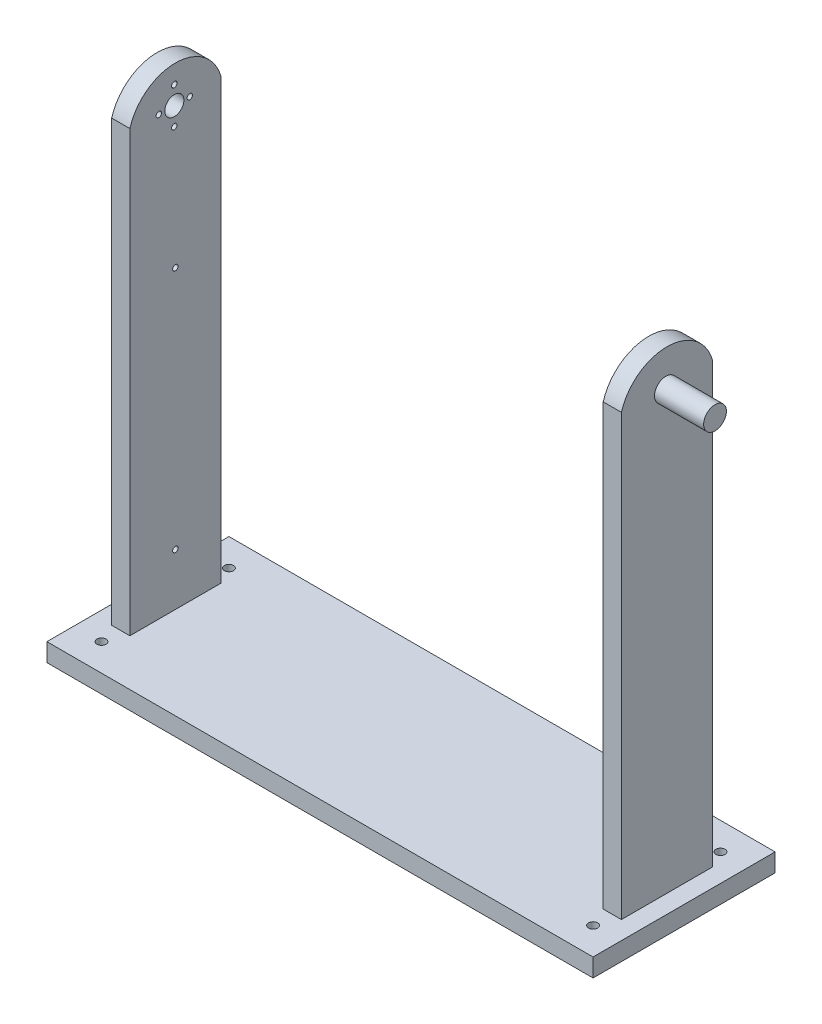
ISO-10303-21;
HEADER;
FILE_DESCRIPTION(('STEP AP214'),'2;1');
FILE_NAME('part.step','',(''),(''),'','','');
FILE_SCHEMA(('AUTOMOTIVE_DESIGN { 1 0 10303 214 1 1 1 1 }'));
ENDSEC;
DATA;
#1=APPLICATION_CONTEXT('core data for automotive mechanical design processes');
#2=APPLICATION_PROTOCOL_DEFINITION('international standard','automotive_design',2000,#1);
#3=PRODUCT_CONTEXT('',#1,'mechanical');
#4=PRODUCT('Part','Part','',(#3));
#5=PRODUCT_RELATED_PRODUCT_CATEGORY('part','',(#4));
#6=PRODUCT_DEFINITION_FORMATION('','',#4);
#7=PRODUCT_DEFINITION_CONTEXT('part definition',#1,'design');
#8=PRODUCT_DEFINITION('design','',#6,#7);
#9=PRODUCT_DEFINITION_SHAPE('','',#8);
#10=(LENGTH_UNIT() NAMED_UNIT(*) SI_UNIT(.MILLI.,.METRE.));
#11=(NAMED_UNIT(*) PLANE_ANGLE_UNIT() SI_UNIT($,.RADIAN.));
#12=(NAMED_UNIT(*) SI_UNIT($,.STERADIAN.) SOLID_ANGLE_UNIT());
#13=UNCERTAINTY_MEASURE_WITH_UNIT(LENGTH_MEASURE(1.E-05),#10,'distance_accuracy_value','');
#14=(GEOMETRIC_REPRESENTATION_CONTEXT(3) GLOBAL_UNCERTAINTY_ASSIGNED_CONTEXT((#13)) GLOBAL_UNIT_ASSIGNED_CONTEXT((#10,
#11,#12)) REPRESENTATION_CONTEXT('',''));
#15=CARTESIAN_POINT('',(0.,0.,0.));
#16=DIRECTION('',(0.,0.,1.));
#17=DIRECTION('',(1.,0.,0.));
#18=AXIS2_PLACEMENT_3D('',#15,#16,#17);
#19=CARTESIAN_POINT('',(-102.335254296901,270.,83.5468195356654));
#20=DIRECTION('',(-1.,0.,0.));
#21=DIRECTION('',(0.,0.,1.));
#22=AXIS2_PLACEMENT_3D('',#19,#20,#21);
#23=PLANE('',#22);
#24=CARTESIAN_POINT('',(-102.335254296901,250.,50.626371929153));
#25=DIRECTION('',(-1.,0.,0.));
#26=DIRECTION('',(0.,0.,1.));
#27=AXIS2_PLACEMENT_3D('',#24,#25,#26);
#28=CIRCLE('',#27,1.5);
#29=CARTESIAN_POINT('',(-102.335254296901,250.,52.126371929153));
#30=VERTEX_POINT('',#29);
#31=EDGE_CURVE('E390',#30,#30,#28,.T.);
#32=ORIENTED_EDGE('',*,*,#31,.F.);
#33=EDGE_LOOP('',(#32));
#34=FACE_BOUND('',#33,.T.);
#35=CARTESIAN_POINT('',(-102.335254296901,250.,67.626371929153));
#36=DIRECTION('',(-1.,0.,0.));
#37=DIRECTION('',(0.,0.,-1.));
#38=AXIS2_PLACEMENT_3D('',#35,#36,#37);
#39=CIRCLE('',#38,1.5);
#40=CARTESIAN_POINT('',(-102.335254296901,250.,66.126371929153));
#41=VERTEX_POINT('',#40);
#42=EDGE_CURVE('E398',#41,#41,#39,.T.);
#43=ORIENTED_EDGE('',*,*,#42,.F.);
#44=EDGE_LOOP('',(#43));
#45=FACE_BOUND('',#44,.T.);
#46=CARTESIAN_POINT('',(-102.335254296901,260.,59.126371929153));
#47=DIRECTION('',(-1.,0.,0.));
#48=DIRECTION('',(0.,0.,1.));
#49=AXIS2_PLACEMENT_3D('',#46,#47,#48);
#50=CIRCLE('',#49,1.5);
#51=CARTESIAN_POINT('',(-102.335254296901,260.,60.626371929153));
#52=VERTEX_POINT('',#51);
#53=EDGE_CURVE('E374',#52,#52,#50,.T.);
#54=ORIENTED_EDGE('',*,*,#53,.F.);
#55=EDGE_LOOP('',(#54));
#56=FACE_BOUND('',#55,.T.);
#57=CARTESIAN_POINT('',(-102.335254296901,240.,59.126371929153));
#58=DIRECTION('',(-1.,0.,0.));
#59=DIRECTION('',(0.,0.,-1.));
#60=AXIS2_PLACEMENT_3D('',#57,#58,#59);
#61=CIRCLE('',#60,1.5);
#62=CARTESIAN_POINT('',(-102.335254296901,240.,57.626371929153));
#63=VERTEX_POINT('',#62);
#64=EDGE_CURVE('E382',#63,#63,#61,.T.);
#65=ORIENTED_EDGE('',*,*,#64,.F.);
#66=EDGE_LOOP('',(#65));
#67=FACE_BOUND('',#66,.T.);
#68=CARTESIAN_POINT('',(-102.335254296901,172.564056086799,58.5468195356654));
#69=DIRECTION('',(-1.,0.,0.));
#70=DIRECTION('',(0.,0.,1.));
#71=AXIS2_PLACEMENT_3D('',#68,#69,#70);
#72=CIRCLE('',#71,1.5);
#73=CARTESIAN_POINT('',(-102.335254296901,172.564056086799,60.0468195356654));
#74=VERTEX_POINT('',#73);
#75=EDGE_CURVE('E358',#74,#74,#72,.T.);
#76=ORIENTED_EDGE('',*,*,#75,.F.);
#77=EDGE_LOOP('',(#76));
#78=FACE_BOUND('',#77,.T.);
#79=CARTESIAN_POINT('',(-102.335254296901,38.5640560867986,58.5468195356668));
#80=DIRECTION('',(-1.,0.,0.));
#81=DIRECTION('',(0.,0.,1.));
#82=AXIS2_PLACEMENT_3D('',#79,#80,#81);
#83=CIRCLE('',#82,1.5);
#84=CARTESIAN_POINT('',(-102.335254296901,38.5640560867986,60.0468195356668));
#85=VERTEX_POINT('',#84);
#86=EDGE_CURVE('E366',#85,#85,#83,.T.);
#87=ORIENTED_EDGE('',*,*,#86,.F.);
#88=EDGE_LOOP('',(#87));
#89=FACE_BOUND('',#88,.T.);
#90=CARTESIAN_POINT('',(-102.335254296901,250.,59.126371929153));
#91=DIRECTION('',(-1.,0.,0.));
#92=DIRECTION('',(0.,0.,1.));
#93=AXIS2_PLACEMENT_3D('',#90,#91,#92);
#94=CIRCLE('',#93,5.25);
#95=CARTESIAN_POINT('',(-102.335254296901,250.,64.376371929153));
#96=VERTEX_POINT('',#95);
#97=EDGE_CURVE('E163',#96,#96,#94,.T.);
#98=ORIENTED_EDGE('',*,*,#97,.F.);
#99=EDGE_LOOP('',(#98));
#100=FACE_BOUND('',#99,.T.);
#101=CARTESIAN_POINT('',(-102.335254296901,243.949466522954,58.5468195356654));
#102=DIRECTION('',(-1.,0.,0.));
#103=DIRECTION('',(0.,0.,1.));
#104=AXIS2_PLACEMENT_3D('',#101,#102,#103);
#105=CIRCLE('',#104,26.0505334770456);
#106=CARTESIAN_POINT('',(-102.335254296901,251.272737270283,33.5468195356654));
#107=VERTEX_POINT('',#106);
#108=CARTESIAN_POINT('',(-102.335254296901,251.272737270283,83.5468195356654));
#109=VERTEX_POINT('',#108);
#110=EDGE_CURVE('E324',#107,#109,#105,.F.);
#111=ORIENTED_EDGE('',*,*,#110,.F.);
#112=DIRECTION('',(0.,-1.,0.));
#113=VECTOR('',#112,1.);
#114=CARTESIAN_POINT('',(-102.335254296901,270.,33.5468195356654));
#115=LINE('',#114,#113);
#116=CARTESIAN_POINT('',(-102.335254296901,10.,33.5468195356654));
#117=VERTEX_POINT('',#116);
#118=EDGE_CURVE('E63',#107,#117,#115,.T.);
#119=ORIENTED_EDGE('',*,*,#118,.T.);
#120=DIRECTION('',(0.,0.,-1.));
#121=VECTOR('',#120,1.);
#122=CARTESIAN_POINT('',(-102.335254296901,10.,83.5468195356654));
#123=LINE('',#122,#121);
#124=CARTESIAN_POINT('',(-102.335254296901,10.,83.5468195356654));
#125=VERTEX_POINT('',#124);
#126=EDGE_CURVE('E198',#125,#117,#123,.T.);
#127=ORIENTED_EDGE('',*,*,#126,.F.);
#128=DIRECTION('',(0.,-1.,0.));
#129=VECTOR('',#128,1.);
#130=CARTESIAN_POINT('',(-102.335254296901,270.,83.5468195356654));
#131=LINE('',#130,#129);
#132=EDGE_CURVE('E205',#109,#125,#131,.T.);
#133=ORIENTED_EDGE('',*,*,#132,.F.);
#134=EDGE_LOOP('',(#111,#119,#127,#133));
#135=FACE_BOUND('',#134,.T.);
#136=ADVANCED_FACE('F39',(#34,#45,#56,#67,#78,#89,#100,#135),#23,.T.);
#137=CARTESIAN_POINT('',(-92.3352542969012,270.,83.5468195356654));
#138=DIRECTION('',(-1.,0.,0.));
#139=DIRECTION('',(0.,0.,1.));
#140=AXIS2_PLACEMENT_3D('',#137,#138,#139);
#141=PLANE('',#140);
#142=CARTESIAN_POINT('',(-92.3352542969012,250.,50.626371929153));
#143=DIRECTION('',(-1.,0.,0.));
#144=DIRECTION('',(0.,0.,1.));
#145=AXIS2_PLACEMENT_3D('',#142,#143,#144);
#146=CIRCLE('',#145,1.5);
#147=CARTESIAN_POINT('',(-92.3352542969012,250.,52.126371929153));
#148=VERTEX_POINT('',#147);
#149=EDGE_CURVE('E386',#148,#148,#146,.F.);
#150=ORIENTED_EDGE('',*,*,#149,.F.);
#151=EDGE_LOOP('',(#150));
#152=FACE_BOUND('',#151,.T.);
#153=CARTESIAN_POINT('',(-92.3352542969012,250.,67.626371929153));
#154=DIRECTION('',(-1.,0.,0.));
#155=DIRECTION('',(0.,0.,1.));
#156=AXIS2_PLACEMENT_3D('',#153,#154,#155);
#157=CIRCLE('',#156,1.5);
#158=CARTESIAN_POINT('',(-92.3352542969012,250.,69.126371929153));
#159=VERTEX_POINT('',#158);
#160=EDGE_CURVE('E394',#159,#159,#157,.F.);
#161=ORIENTED_EDGE('',*,*,#160,.F.);
#162=EDGE_LOOP('',(#161));
#163=FACE_BOUND('',#162,.T.);
#164=CARTESIAN_POINT('',(-92.3352542969012,260.,59.126371929153));
#165=DIRECTION('',(-1.,0.,0.));
#166=DIRECTION('',(0.,0.,1.));
#167=AXIS2_PLACEMENT_3D('',#164,#165,#166);
#168=CIRCLE('',#167,1.5);
#169=CARTESIAN_POINT('',(-92.3352542969012,260.,60.626371929153));
#170=VERTEX_POINT('',#169);
#171=EDGE_CURVE('E370',#170,#170,#168,.F.);
#172=ORIENTED_EDGE('',*,*,#171,.F.);
#173=EDGE_LOOP('',(#172));
#174=FACE_BOUND('',#173,.T.);
#175=CARTESIAN_POINT('',(-92.3352542969012,240.,59.126371929153));
#176=DIRECTION('',(-1.,0.,0.));
#177=DIRECTION('',(0.,0.,1.));
#178=AXIS2_PLACEMENT_3D('',#175,#176,#177);
#179=CIRCLE('',#178,1.5);
#180=CARTESIAN_POINT('',(-92.3352542969012,240.,60.626371929153));
#181=VERTEX_POINT('',#180);
#182=EDGE_CURVE('E378',#181,#181,#179,.F.);
#183=ORIENTED_EDGE('',*,*,#182,.F.);
#184=EDGE_LOOP('',(#183));
#185=FACE_BOUND('',#184,.T.);
#186=CARTESIAN_POINT('',(-92.3352542969012,172.564056086799,58.5468195356654));
#187=DIRECTION('',(-1.,0.,0.));
#188=DIRECTION('',(0.,0.,1.));
#189=AXIS2_PLACEMENT_3D('',#186,#187,#188);
#190=CIRCLE('',#189,1.5);
#191=CARTESIAN_POINT('',(-92.3352542969012,172.564056086799,60.0468195356654));
#192=VERTEX_POINT('',#191);
#193=EDGE_CURVE('E347',#192,#192,#190,.F.);
#194=ORIENTED_EDGE('',*,*,#193,.F.);
#195=EDGE_LOOP('',(#194));
#196=FACE_BOUND('',#195,.T.);
#197=CARTESIAN_POINT('',(-92.3352542969012,38.5640560867986,58.5468195356668));
#198=DIRECTION('',(-1.,0.,0.));
#199=DIRECTION('',(0.,0.,1.));
#200=AXIS2_PLACEMENT_3D('',#197,#198,#199);
#201=CIRCLE('',#200,1.5);
#202=CARTESIAN_POINT('',(-92.3352542969012,38.5640560867986,60.0468195356668));
#203=VERTEX_POINT('',#202);
#204=EDGE_CURVE('E362',#203,#203,#201,.F.);
#205=ORIENTED_EDGE('',*,*,#204,.F.);
#206=EDGE_LOOP('',(#205));
#207=FACE_BOUND('',#206,.T.);
#208=CARTESIAN_POINT('',(-92.3352542969012,250.,59.126371929153));
#209=DIRECTION('',(-1.,0.,0.));
#210=DIRECTION('',(0.,0.,1.));
#211=AXIS2_PLACEMENT_3D('',#208,#209,#210);
#212=CIRCLE('',#211,5.25);
#213=CARTESIAN_POINT('',(-92.3352542969012,250.,64.376371929153));
#214=VERTEX_POINT('',#213);
#215=EDGE_CURVE('E157',#214,#214,#212,.F.);
#216=ORIENTED_EDGE('',*,*,#215,.F.);
#217=EDGE_LOOP('',(#216));
#218=FACE_BOUND('',#217,.T.);
#219=DIRECTION('',(0.,-1.,0.));
#220=VECTOR('',#219,1.);
#221=CARTESIAN_POINT('',(-92.3352542969012,270.,33.5468195356654));
#222=LINE('',#221,#220);
#223=CARTESIAN_POINT('',(-92.3352542969012,251.272737270283,33.5468195356654));
#224=VERTEX_POINT('',#223);
#225=CARTESIAN_POINT('',(-92.3352542969012,10.,33.5468195356654));
#226=VERTEX_POINT('',#225);
#227=EDGE_CURVE('E201',#224,#226,#222,.T.);
#228=ORIENTED_EDGE('',*,*,#227,.F.);
#229=CARTESIAN_POINT('',(-92.3352542969012,243.949466522954,58.5468195356654));
#230=DIRECTION('',(-1.,0.,0.));
#231=DIRECTION('',(0.,0.,1.));
#232=AXIS2_PLACEMENT_3D('',#229,#230,#231);
#233=CIRCLE('',#232,26.0505334770456);
#234=CARTESIAN_POINT('',(-92.3352542969012,251.272737270283,83.5468195356654));
#235=VERTEX_POINT('',#234);
#236=EDGE_CURVE('E141',#224,#235,#233,.F.);
#237=ORIENTED_EDGE('',*,*,#236,.T.);
#238=DIRECTION('',(0.,-1.,0.));
#239=VECTOR('',#238,1.);
#240=CARTESIAN_POINT('',(-92.3352542969012,270.,83.5468195356654));
#241=LINE('',#240,#239);
#242=CARTESIAN_POINT('',(-92.3352542969012,10.,83.5468195356654));
#243=VERTEX_POINT('',#242);
#244=EDGE_CURVE('E208',#235,#243,#241,.T.);
#245=ORIENTED_EDGE('',*,*,#244,.T.);
#246=DIRECTION('',(0.,0.,-1.));
#247=VECTOR('',#246,1.);
#248=CARTESIAN_POINT('',(-92.3352542969012,10.,83.5468195356654));
#249=LINE('',#248,#247);
#250=EDGE_CURVE('E190',#243,#226,#249,.T.);
#251=ORIENTED_EDGE('',*,*,#250,.T.);
#252=EDGE_LOOP('',(#228,#237,#245,#251));
#253=FACE_BOUND('',#252,.T.);
#254=ADVANCED_FACE('F337',(#152,#163,#174,#185,#196,#207,#218,#253),#141,.F.);
#255=CARTESIAN_POINT('',(177.664745703099,270.,83.5468195356653));
#256=DIRECTION('',(-1.,0.,0.));
#257=DIRECTION('',(0.,0.,1.));
#258=AXIS2_PLACEMENT_3D('',#255,#256,#257);
#259=PLANE('',#258);
#260=CARTESIAN_POINT('',(177.664745703099,250.,59.126371929153));
#261=DIRECTION('',(-1.,0.,0.));
#262=DIRECTION('',(0.,0.,1.));
#263=AXIS2_PLACEMENT_3D('',#260,#261,#262);
#264=CIRCLE('',#263,6.25);
#265=CARTESIAN_POINT('',(177.664745703099,250.,65.376371929153));
#266=VERTEX_POINT('',#265);
#267=EDGE_CURVE('E11',#266,#266,#264,.F.);
#268=ORIENTED_EDGE('',*,*,#267,.F.);
#269=EDGE_LOOP('',(#268));
#270=FACE_BOUND('',#269,.T.);
#271=DIRECTION('',(0.,-1.,0.));
#272=VECTOR('',#271,1.);
#273=CARTESIAN_POINT('',(177.664745703099,270.,33.5468195356654));
#274=LINE('',#273,#272);
#275=CARTESIAN_POINT('',(177.664745703099,251.272737270283,33.5468195356654));
#276=VERTEX_POINT('',#275);
#277=CARTESIAN_POINT('',(177.664745703099,10.,33.5468195356654));
#278=VERTEX_POINT('',#277);
#279=EDGE_CURVE('E147',#276,#278,#274,.T.);
#280=ORIENTED_EDGE('',*,*,#279,.F.);
#281=CARTESIAN_POINT('',(177.664745703099,243.949466522954,58.5468195356654));
#282=DIRECTION('',(-1.,0.,0.));
#283=DIRECTION('',(0.,0.,1.));
#284=AXIS2_PLACEMENT_3D('',#281,#282,#283);
#285=CIRCLE('',#284,26.0505334770456);
#286=CARTESIAN_POINT('',(177.664745703099,251.272737270283,83.5468195356654));
#287=VERTEX_POINT('',#286);
#288=EDGE_CURVE('E132',#276,#287,#285,.F.);
#289=ORIENTED_EDGE('',*,*,#288,.T.);
#290=DIRECTION('',(0.,-1.,0.));
#291=VECTOR('',#290,1.);
#292=CARTESIAN_POINT('',(177.664745703099,270.,83.5468195356653));
#293=LINE('',#292,#291);
#294=CARTESIAN_POINT('',(177.664745703099,10.,83.5468195356653));
#295=VERTEX_POINT('',#294);
#296=EDGE_CURVE('E170',#287,#295,#293,.T.);
#297=ORIENTED_EDGE('',*,*,#296,.T.);
#298=DIRECTION('',(0.,0.,-1.));
#299=VECTOR('',#298,1.);
#300=CARTESIAN_POINT('',(177.664745703099,10.,83.5468195356653));
#301=LINE('',#300,#299);
#302=EDGE_CURVE('E154',#295,#278,#301,.T.);
#303=ORIENTED_EDGE('',*,*,#302,.T.);
#304=EDGE_LOOP('',(#280,#289,#297,#303));
#305=FACE_BOUND('',#304,.T.);
#306=ADVANCED_FACE('F152',(#270,#305),#259,.F.);
#307=CARTESIAN_POINT('',(167.664745703099,270.,83.5468195356654));
#308=DIRECTION('',(-1.,0.,0.));
#309=DIRECTION('',(0.,0.,1.));
#310=AXIS2_PLACEMENT_3D('',#307,#308,#309);
#311=PLANE('',#310);
#312=CARTESIAN_POINT('',(167.664745703099,250.,59.126371929153));
#313=DIRECTION('',(-1.,0.,0.));
#314=DIRECTION('',(0.,0.,1.));
#315=AXIS2_PLACEMENT_3D('',#312,#313,#314);
#316=CIRCLE('',#315,5.25);
#317=CARTESIAN_POINT('',(167.664745703099,250.,64.376371929153));
#318=VERTEX_POINT('',#317);
#319=EDGE_CURVE('E410',#318,#318,#316,.T.);
#320=ORIENTED_EDGE('',*,*,#319,.F.);
#321=EDGE_LOOP('',(#320));
#322=FACE_BOUND('',#321,.T.);
#323=CARTESIAN_POINT('',(167.664745703099,243.949466522954,58.5468195356654));
#324=DIRECTION('',(-1.,0.,0.));
#325=DIRECTION('',(0.,0.,1.));
#326=AXIS2_PLACEMENT_3D('',#323,#324,#325);
#327=CIRCLE('',#326,26.0505334770456);
#328=CARTESIAN_POINT('',(167.664745703099,251.272737270283,33.5468195356654));
#329=VERTEX_POINT('',#328);
#330=CARTESIAN_POINT('',(167.664745703099,251.272737270283,83.5468195356654));
#331=VERTEX_POINT('',#330);
#332=EDGE_CURVE('E142',#329,#331,#327,.F.);
#333=ORIENTED_EDGE('',*,*,#332,.F.);
#334=DIRECTION('',(0.,-1.,0.));
#335=VECTOR('',#334,1.);
#336=CARTESIAN_POINT('',(167.664745703099,270.,33.5468195356654));
#337=LINE('',#336,#335);
#338=CARTESIAN_POINT('',(167.664745703099,10.,33.5468195356654));
#339=VERTEX_POINT('',#338);
#340=EDGE_CURVE('E149',#329,#339,#337,.T.);
#341=ORIENTED_EDGE('',*,*,#340,.T.);
#342=DIRECTION('',(0.,0.,-1.));
#343=VECTOR('',#342,1.);
#344=CARTESIAN_POINT('',(167.664745703099,10.,83.5468195356654));
#345=LINE('',#344,#343);
#346=CARTESIAN_POINT('',(167.664745703099,10.,83.5468195356654));
#347=VERTEX_POINT('',#346);
#348=EDGE_CURVE('E177',#347,#339,#345,.T.);
#349=ORIENTED_EDGE('',*,*,#348,.F.);
#350=DIRECTION('',(0.,-1.,0.));
#351=VECTOR('',#350,1.);
#352=CARTESIAN_POINT('',(167.664745703099,270.,83.5468195356654));
#353=LINE('',#352,#351);
#354=EDGE_CURVE('E55',#331,#347,#353,.T.);
#355=ORIENTED_EDGE('',*,*,#354,.F.);
#356=EDGE_LOOP('',(#333,#341,#349,#355));
#357=FACE_BOUND('',#356,.T.);
#358=ADVANCED_FACE('F308',(#322,#357),#311,.T.);
#359=CARTESIAN_POINT('',(0.,10.,0.));
#360=DIRECTION('',(0.,-1.,0.));
#361=DIRECTION('',(0.,0.,-1.));
#362=AXIS2_PLACEMENT_3D('',#359,#360,#361);
#363=PLANE('',#362);
#364=CARTESIAN_POINT('',(172.664745703099,10.,94.126371929153));
#365=DIRECTION('',(0.,1.,0.));
#366=DIRECTION('',(0.,0.,1.));
#367=AXIS2_PLACEMENT_3D('',#364,#365,#366);
#368=CIRCLE('',#367,2.5);
#369=CARTESIAN_POINT('',(172.664745703099,10.,96.626371929153));
#370=VERTEX_POINT('',#369);
#371=EDGE_CURVE('E213',#370,#370,#368,.T.);
#372=ORIENTED_EDGE('',*,*,#371,.F.);
#373=EDGE_LOOP('',(#372));
#374=FACE_BOUND('',#373,.T.);
#375=CARTESIAN_POINT('',(172.664745703099,10.,24.126371929153));
#376=DIRECTION('',(0.,1.,0.));
#377=DIRECTION('',(0.,0.,-1.));
#378=AXIS2_PLACEMENT_3D('',#375,#376,#377);
#379=CIRCLE('',#378,2.5);
#380=CARTESIAN_POINT('',(172.664745703099,10.,21.626371929153));
#381=VERTEX_POINT('',#380);
#382=EDGE_CURVE('E221',#381,#381,#379,.T.);
#383=ORIENTED_EDGE('',*,*,#382,.F.);
#384=EDGE_LOOP('',(#383));
#385=FACE_BOUND('',#384,.T.);
#386=CARTESIAN_POINT('',(-97.3352542969012,10.,94.126371929153));
#387=DIRECTION('',(0.,1.,0.));
#388=DIRECTION('',(0.,0.,-1.));
#389=AXIS2_PLACEMENT_3D('',#386,#387,#388);
#390=CIRCLE('',#389,2.5);
#391=CARTESIAN_POINT('',(-97.3352542969012,10.,91.626371929153));
#392=VERTEX_POINT('',#391);
#393=EDGE_CURVE('E229',#392,#392,#390,.T.);
#394=ORIENTED_EDGE('',*,*,#393,.F.);
#395=EDGE_LOOP('',(#394));
#396=FACE_BOUND('',#395,.T.);
#397=CARTESIAN_POINT('',(-97.3352542969012,10.,24.126371929153));
#398=DIRECTION('',(0.,1.,0.));
#399=DIRECTION('',(0.,0.,1.));
#400=AXIS2_PLACEMENT_3D('',#397,#398,#399);
#401=CIRCLE('',#400,2.5);
#402=CARTESIAN_POINT('',(-97.3352542969012,10.,26.626371929153));
#403=VERTEX_POINT('',#402);
#404=EDGE_CURVE('E237',#403,#403,#401,.T.);
#405=ORIENTED_EDGE('',*,*,#404,.F.);
#406=EDGE_LOOP('',(#405));
#407=FACE_BOUND('',#406,.T.);
#408=DIRECTION('',(0.,0.,-1.));
#409=VECTOR('',#408,1.);
#410=CARTESIAN_POINT('',(187.664745703099,10.,109.126371929153));
#411=LINE('',#410,#409);
#412=CARTESIAN_POINT('',(187.664745703099,10.,109.126371929153));
#413=VERTEX_POINT('',#412);
#414=CARTESIAN_POINT('',(187.664745703099,10.,9.12637192915297));
#415=VERTEX_POINT('',#414);
#416=EDGE_CURVE('E245',#413,#415,#411,.T.);
#417=ORIENTED_EDGE('',*,*,#416,.T.);
#418=DIRECTION('',(-1.,0.,0.));
#419=VECTOR('',#418,1.);
#420=CARTESIAN_POINT('',(-112.335254296901,10.,9.12637192915297));
#421=LINE('',#420,#419);
#422=CARTESIAN_POINT('',(-112.335254296901,10.,9.12637192915297));
#423=VERTEX_POINT('',#422);
#424=EDGE_CURVE('E249',#415,#423,#421,.T.);
#425=ORIENTED_EDGE('',*,*,#424,.T.);
#426=DIRECTION('',(0.,0.,1.));
#427=VECTOR('',#426,1.);
#428=CARTESIAN_POINT('',(-112.335254296901,10.,109.126371929153));
#429=LINE('',#428,#427);
#430=CARTESIAN_POINT('',(-112.335254296901,10.,109.126371929153));
#431=VERTEX_POINT('',#430);
#432=EDGE_CURVE('E253',#423,#431,#429,.T.);
#433=ORIENTED_EDGE('',*,*,#432,.T.);
#434=DIRECTION('',(1.,0.,0.));
#435=VECTOR('',#434,1.);
#436=CARTESIAN_POINT('',(-112.335254296901,10.,109.126371929153));
#437=LINE('',#436,#435);
#438=EDGE_CURVE('E256',#431,#413,#437,.T.);
#439=ORIENTED_EDGE('',*,*,#438,.T.);
#440=EDGE_LOOP('',(#417,#425,#433,#439));
#441=FACE_BOUND('',#440,.T.);
#442=ORIENTED_EDGE('',*,*,#126,.T.);
#443=DIRECTION('',(1.,0.,0.));
#444=VECTOR('',#443,1.);
#445=CARTESIAN_POINT('',(-102.335254296901,10.,33.5468195356654));
#446=LINE('',#445,#444);
#447=EDGE_CURVE('E186',#117,#226,#446,.T.);
#448=ORIENTED_EDGE('',*,*,#447,.T.);
#449=ORIENTED_EDGE('',*,*,#250,.F.);
#450=DIRECTION('',(1.,0.,0.));
#451=VECTOR('',#450,1.);
#452=CARTESIAN_POINT('',(-102.335254296901,10.,83.5468195356654));
#453=LINE('',#452,#451);
#454=EDGE_CURVE('E194',#125,#243,#453,.T.);
#455=ORIENTED_EDGE('',*,*,#454,.F.);
#456=EDGE_LOOP('',(#442,#448,#449,#455));
#457=FACE_BOUND('',#456,.T.);
#458=ORIENTED_EDGE('',*,*,#302,.F.);
#459=DIRECTION('',(-1.,0.,0.));
#460=VECTOR('',#459,1.);
#461=CARTESIAN_POINT('',(177.664745703099,10.,83.5468195356653));
#462=LINE('',#461,#460);
#463=EDGE_CURVE('E173',#295,#347,#462,.T.);
#464=ORIENTED_EDGE('',*,*,#463,.T.);
#465=ORIENTED_EDGE('',*,*,#348,.T.);
#466=DIRECTION('',(-1.,0.,0.));
#467=VECTOR('',#466,1.);
#468=CARTESIAN_POINT('',(177.664745703099,10.,33.5468195356654));
#469=LINE('',#468,#467);
#470=EDGE_CURVE('E181',#278,#339,#469,.T.);
#471=ORIENTED_EDGE('',*,*,#470,.F.);
#472=EDGE_LOOP('',(#458,#464,#465,#471));
#473=FACE_BOUND('',#472,.T.);
#474=ADVANCED_FACE('F305',(#374,#385,#396,#407,#441,#457,#473),#363,.F.);
#475=CARTESIAN_POINT('',(0.,0.,0.));
#476=DIRECTION('',(0.,-1.,0.));
#477=DIRECTION('',(0.,0.,-1.));
#478=AXIS2_PLACEMENT_3D('',#475,#476,#477);
#479=PLANE('',#478);
#480=CARTESIAN_POINT('',(172.664745703099,0.,24.126371929153));
#481=DIRECTION('',(0.,1.,0.));
#482=DIRECTION('',(0.,0.,-1.));
#483=AXIS2_PLACEMENT_3D('',#480,#481,#482);
#484=CIRCLE('',#483,2.5);
#485=CARTESIAN_POINT('',(172.664745703099,0.,21.626371929153));
#486=VERTEX_POINT('',#485);
#487=EDGE_CURVE('E217',#486,#486,#484,.T.);
#488=ORIENTED_EDGE('',*,*,#487,.T.);
#489=EDGE_LOOP('',(#488));
#490=FACE_BOUND('',#489,.T.);
#491=CARTESIAN_POINT('',(-97.3352542969012,0.,24.126371929153));
#492=DIRECTION('',(0.,1.,0.));
#493=DIRECTION('',(0.,0.,1.));
#494=AXIS2_PLACEMENT_3D('',#491,#492,#493);
#495=CIRCLE('',#494,2.5);
#496=CARTESIAN_POINT('',(-97.3352542969012,0.,26.626371929153));
#497=VERTEX_POINT('',#496);
#498=EDGE_CURVE('E233',#497,#497,#495,.T.);
#499=ORIENTED_EDGE('',*,*,#498,.T.);
#500=EDGE_LOOP('',(#499));
#501=FACE_BOUND('',#500,.T.);
#502=DIRECTION('',(0.,0.,-1.));
#503=VECTOR('',#502,1.);
#504=CARTESIAN_POINT('',(187.664745703099,0.,109.126371929153));
#505=LINE('',#504,#503);
#506=CARTESIAN_POINT('',(187.664745703099,0.,109.126371929153));
#507=VERTEX_POINT('',#506);
#508=CARTESIAN_POINT('',(187.664745703099,0.,9.12637192915297));
#509=VERTEX_POINT('',#508);
#510=EDGE_CURVE('E241',#507,#509,#505,.T.);
#511=ORIENTED_EDGE('',*,*,#510,.F.);
#512=DIRECTION('',(1.,0.,0.));
#513=VECTOR('',#512,1.);
#514=CARTESIAN_POINT('',(-112.335254296901,0.,109.126371929153));
#515=LINE('',#514,#513);
#516=CARTESIAN_POINT('',(-112.335254296901,0.,109.126371929153));
#517=VERTEX_POINT('',#516);
#518=EDGE_CURVE('E250',#517,#507,#515,.T.);
#519=ORIENTED_EDGE('',*,*,#518,.F.);
#520=DIRECTION('',(0.,0.,1.));
#521=VECTOR('',#520,1.);
#522=CARTESIAN_POINT('',(-112.335254296901,0.,109.126371929153));
#523=LINE('',#522,#521);
#524=CARTESIAN_POINT('',(-112.335254296901,0.,9.12637192915297));
#525=VERTEX_POINT('',#524);
#526=EDGE_CURVE('E266',#525,#517,#523,.T.);
#527=ORIENTED_EDGE('',*,*,#526,.F.);
#528=DIRECTION('',(-1.,0.,0.));
#529=VECTOR('',#528,1.);
#530=CARTESIAN_POINT('',(-112.335254296901,0.,9.12637192915297));
#531=LINE('',#530,#529);
#532=EDGE_CURVE('E263',#509,#525,#531,.T.);
#533=ORIENTED_EDGE('',*,*,#532,.F.);
#534=EDGE_LOOP('',(#511,#519,#527,#533));
#535=FACE_BOUND('',#534,.T.);
#536=CARTESIAN_POINT('',(-97.3352542969012,0.,94.126371929153));
#537=DIRECTION('',(0.,1.,0.));
#538=DIRECTION('',(0.,0.,-1.));
#539=AXIS2_PLACEMENT_3D('',#536,#537,#538);
#540=CIRCLE('',#539,2.5);
#541=CARTESIAN_POINT('',(-97.3352542969012,0.,91.626371929153));
#542=VERTEX_POINT('',#541);
#543=EDGE_CURVE('E225',#542,#542,#540,.T.);
#544=ORIENTED_EDGE('',*,*,#543,.T.);
#545=EDGE_LOOP('',(#544));
#546=FACE_BOUND('',#545,.T.);
#547=CARTESIAN_POINT('',(172.664745703099,0.,94.126371929153));
#548=DIRECTION('',(0.,1.,0.));
#549=DIRECTION('',(0.,0.,1.));
#550=AXIS2_PLACEMENT_3D('',#547,#548,#549);
#551=CIRCLE('',#550,2.5);
#552=CARTESIAN_POINT('',(172.664745703099,0.,96.626371929153));
#553=VERTEX_POINT('',#552);
#554=EDGE_CURVE('E204',#553,#553,#551,.T.);
#555=ORIENTED_EDGE('',*,*,#554,.T.);
#556=EDGE_LOOP('',(#555));
#557=FACE_BOUND('',#556,.T.);
#558=ADVANCED_FACE('F294',(#490,#501,#535,#546,#557),#479,.T.);
#559=CARTESIAN_POINT('',(187.664745703099,10.,109.126371929153));
#560=DIRECTION('',(-1.,0.,0.));
#561=DIRECTION('',(0.,0.,1.));
#562=AXIS2_PLACEMENT_3D('',#559,#560,#561);
#563=PLANE('',#562);
#564=ORIENTED_EDGE('',*,*,#510,.T.);
#565=DIRECTION('',(0.,-1.,0.));
#566=VECTOR('',#565,1.);
#567=CARTESIAN_POINT('',(187.664745703099,10.,9.12637192915297));
#568=LINE('',#567,#566);
#569=EDGE_CURVE('E151',#415,#509,#568,.T.);
#570=ORIENTED_EDGE('',*,*,#569,.F.);
#571=ORIENTED_EDGE('',*,*,#416,.F.);
#572=DIRECTION('',(0.,-1.,0.));
#573=VECTOR('',#572,1.);
#574=CARTESIAN_POINT('',(187.664745703099,10.,109.126371929153));
#575=LINE('',#574,#573);
#576=EDGE_CURVE('E259',#413,#507,#575,.T.);
#577=ORIENTED_EDGE('',*,*,#576,.T.);
#578=EDGE_LOOP('',(#564,#570,#571,#577));
#579=FACE_BOUND('',#578,.T.);
#580=ADVANCED_FACE('F41',(#579),#563,.F.);
#581=CARTESIAN_POINT('',(-112.335254296901,10.,9.12637192915297));
#582=DIRECTION('',(0.,0.,1.));
#583=DIRECTION('',(1.,0.,0.));
#584=AXIS2_PLACEMENT_3D('',#581,#582,#583);
#585=PLANE('',#584);
#586=ORIENTED_EDGE('',*,*,#532,.T.);
#587=DIRECTION('',(0.,-1.,0.));
#588=VECTOR('',#587,1.);
#589=CARTESIAN_POINT('',(-112.335254296901,10.,9.12637192915297));
#590=LINE('',#589,#588);
#591=EDGE_CURVE('E278',#423,#525,#590,.T.);
#592=ORIENTED_EDGE('',*,*,#591,.F.);
#593=ORIENTED_EDGE('',*,*,#424,.F.);
#594=ORIENTED_EDGE('',*,*,#569,.T.);
#595=EDGE_LOOP('',(#586,#592,#593,#594));
#596=FACE_BOUND('',#595,.T.);
#597=ADVANCED_FACE('F286',(#596),#585,.F.);
#598=CARTESIAN_POINT('',(-112.335254296901,10.,109.126371929153));
#599=DIRECTION('',(1.,0.,0.));
#600=DIRECTION('',(0.,0.,-1.));
#601=AXIS2_PLACEMENT_3D('',#598,#599,#600);
#602=PLANE('',#601);
#603=ORIENTED_EDGE('',*,*,#526,.T.);
#604=DIRECTION('',(0.,-1.,0.));
#605=VECTOR('',#604,1.);
#606=CARTESIAN_POINT('',(-112.335254296901,10.,109.126371929153));
#607=LINE('',#606,#605);
#608=EDGE_CURVE('E274',#431,#517,#607,.T.);
#609=ORIENTED_EDGE('',*,*,#608,.F.);
#610=ORIENTED_EDGE('',*,*,#432,.F.);
#611=ORIENTED_EDGE('',*,*,#591,.T.);
#612=EDGE_LOOP('',(#603,#609,#610,#611));
#613=FACE_BOUND('',#612,.T.);
#614=ADVANCED_FACE('F299',(#613),#602,.F.);
#615=CARTESIAN_POINT('',(-112.335254296901,10.,109.126371929153));
#616=DIRECTION('',(0.,0.,-1.));
#617=DIRECTION('',(-1.,0.,0.));
#618=AXIS2_PLACEMENT_3D('',#615,#616,#617);
#619=PLANE('',#618);
#620=ORIENTED_EDGE('',*,*,#518,.T.);
#621=ORIENTED_EDGE('',*,*,#576,.F.);
#622=ORIENTED_EDGE('',*,*,#438,.F.);
#623=ORIENTED_EDGE('',*,*,#608,.T.);
#624=EDGE_LOOP('',(#620,#621,#622,#623));
#625=FACE_BOUND('',#624,.T.);
#626=ADVANCED_FACE('F303',(#625),#619,.F.);
#627=CARTESIAN_POINT('',(-97.3352542969012,10.,24.126371929153));
#628=DIRECTION('',(0.,-1.,0.));
#629=DIRECTION('',(0.,0.,-1.));
#630=AXIS2_PLACEMENT_3D('',#627,#628,#629);
#631=CYLINDRICAL_SURFACE('',#630,2.5);
#632=ORIENTED_EDGE('',*,*,#404,.T.);
#633=EDGE_LOOP('',(#632));
#634=FACE_BOUND('',#633,.T.);
#635=ORIENTED_EDGE('',*,*,#498,.F.);
#636=EDGE_LOOP('',(#635));
#637=FACE_BOUND('',#636,.T.);
#638=ADVANCED_FACE('F448',(#634,#637),#631,.F.);
#639=CARTESIAN_POINT('',(-97.3352542969012,10.,94.126371929153));
#640=DIRECTION('',(0.,-1.,0.));
#641=DIRECTION('',(0.,0.,-1.));
#642=AXIS2_PLACEMENT_3D('',#639,#640,#641);
#643=CYLINDRICAL_SURFACE('',#642,2.5);
#644=ORIENTED_EDGE('',*,*,#393,.T.);
#645=EDGE_LOOP('',(#644));
#646=FACE_BOUND('',#645,.T.);
#647=ORIENTED_EDGE('',*,*,#543,.F.);
#648=EDGE_LOOP('',(#647));
#649=FACE_BOUND('',#648,.T.);
#650=ADVANCED_FACE('F444',(#646,#649),#643,.F.);
#651=CARTESIAN_POINT('',(172.664745703099,10.,24.126371929153));
#652=DIRECTION('',(0.,-1.,0.));
#653=DIRECTION('',(0.,0.,-1.));
#654=AXIS2_PLACEMENT_3D('',#651,#652,#653);
#655=CYLINDRICAL_SURFACE('',#654,2.5);
#656=ORIENTED_EDGE('',*,*,#382,.T.);
#657=EDGE_LOOP('',(#656));
#658=FACE_BOUND('',#657,.T.);
#659=ORIENTED_EDGE('',*,*,#487,.F.);
#660=EDGE_LOOP('',(#659));
#661=FACE_BOUND('',#660,.T.);
#662=ADVANCED_FACE('F440',(#658,#661),#655,.F.);
#663=CARTESIAN_POINT('',(172.664745703099,10.,94.126371929153));
#664=DIRECTION('',(0.,-1.,0.));
#665=DIRECTION('',(0.,0.,-1.));
#666=AXIS2_PLACEMENT_3D('',#663,#664,#665);
#667=CYLINDRICAL_SURFACE('',#666,2.5);
#668=ORIENTED_EDGE('',*,*,#371,.T.);
#669=EDGE_LOOP('',(#668));
#670=FACE_BOUND('',#669,.T.);
#671=ORIENTED_EDGE('',*,*,#554,.F.);
#672=EDGE_LOOP('',(#671));
#673=FACE_BOUND('',#672,.T.);
#674=ADVANCED_FACE('F437',(#670,#673),#667,.F.);
#675=CARTESIAN_POINT('',(-102.335254296901,270.,33.5468195356654));
#676=DIRECTION('',(0.,0.,-1.));
#677=DIRECTION('',(-1.,0.,0.));
#678=AXIS2_PLACEMENT_3D('',#675,#676,#677);
#679=PLANE('',#678);
#680=DIRECTION('',(-1.,0.,0.));
#681=VECTOR('',#680,1.);
#682=CARTESIAN_POINT('',(187.664745703099,251.272737270283,33.5468195356654));
#683=LINE('',#682,#681);
#684=EDGE_CURVE('E342',#224,#107,#683,.T.);
#685=ORIENTED_EDGE('',*,*,#684,.F.);
#686=ORIENTED_EDGE('',*,*,#227,.T.);
#687=ORIENTED_EDGE('',*,*,#447,.F.);
#688=ORIENTED_EDGE('',*,*,#118,.F.);
#689=EDGE_LOOP('',(#685,#686,#687,#688));
#690=FACE_BOUND('',#689,.T.);
#691=ADVANCED_FACE('F348',(#690),#679,.T.);
#692=CARTESIAN_POINT('',(-102.335254296901,270.,83.5468195356654));
#693=DIRECTION('',(0.,0.,-1.));
#694=DIRECTION('',(-1.,0.,0.));
#695=AXIS2_PLACEMENT_3D('',#692,#693,#694);
#696=PLANE('',#695);
#697=ORIENTED_EDGE('',*,*,#244,.F.);
#698=DIRECTION('',(-1.,0.,0.));
#699=VECTOR('',#698,1.);
#700=CARTESIAN_POINT('',(187.664745703099,251.272737270283,83.5468195356654));
#701=LINE('',#700,#699);
#702=EDGE_CURVE('E318',#235,#109,#701,.T.);
#703=ORIENTED_EDGE('',*,*,#702,.T.);
#704=ORIENTED_EDGE('',*,*,#132,.T.);
#705=ORIENTED_EDGE('',*,*,#454,.T.);
#706=EDGE_LOOP('',(#697,#703,#704,#705));
#707=FACE_BOUND('',#706,.T.);
#708=ADVANCED_FACE('F353',(#707),#696,.F.);
#709=CARTESIAN_POINT('',(177.664745703099,270.,33.5468195356654));
#710=DIRECTION('',(0.,0.,1.));
#711=DIRECTION('',(1.,0.,0.));
#712=AXIS2_PLACEMENT_3D('',#709,#710,#711);
#713=PLANE('',#712);
#714=ORIENTED_EDGE('',*,*,#340,.F.);
#715=DIRECTION('',(-1.,0.,0.));
#716=VECTOR('',#715,1.);
#717=CARTESIAN_POINT('',(187.664745703099,251.272737270283,33.5468195356654));
#718=LINE('',#717,#716);
#719=EDGE_CURVE('E48',#329,#276,#718,.F.);
#720=ORIENTED_EDGE('',*,*,#719,.T.);
#721=ORIENTED_EDGE('',*,*,#279,.T.);
#722=ORIENTED_EDGE('',*,*,#470,.T.);
#723=EDGE_LOOP('',(#714,#720,#721,#722));
#724=FACE_BOUND('',#723,.T.);
#725=ADVANCED_FACE('F145',(#724),#713,.F.);
#726=CARTESIAN_POINT('',(177.664745703099,270.,83.5468195356653));
#727=DIRECTION('',(0.,0.,1.));
#728=DIRECTION('',(1.,0.,0.));
#729=AXIS2_PLACEMENT_3D('',#726,#727,#728);
#730=PLANE('',#729);
#731=EDGE_CURVE('E136',#287,#331,#701,.T.);
#732=ORIENTED_EDGE('',*,*,#731,.T.);
#733=ORIENTED_EDGE('',*,*,#354,.T.);
#734=ORIENTED_EDGE('',*,*,#463,.F.);
#735=ORIENTED_EDGE('',*,*,#296,.F.);
#736=EDGE_LOOP('',(#732,#733,#734,#735));
#737=FACE_BOUND('',#736,.T.);
#738=ADVANCED_FACE('F427',(#737),#730,.T.);
#739=CARTESIAN_POINT('',(-117.184496701819,250.,59.126371929153));
#740=DIRECTION('',(1.,0.,0.));
#741=DIRECTION('',(0.,0.,-1.));
#742=AXIS2_PLACEMENT_3D('',#739,#740,#741);
#743=CYLINDRICAL_SURFACE('',#742,5.25);
#744=ORIENTED_EDGE('',*,*,#97,.T.);
#745=EDGE_LOOP('',(#744));
#746=FACE_BOUND('',#745,.T.);
#747=ORIENTED_EDGE('',*,*,#215,.T.);
#748=EDGE_LOOP('',(#747));
#749=FACE_BOUND('',#748,.T.);
#750=ADVANCED_FACE('F333',(#746,#749),#743,.F.);
#751=CARTESIAN_POINT('',(187.664745703099,243.949466522954,58.5468195356654));
#752=DIRECTION('',(-1.,0.,0.));
#753=DIRECTION('',(0.,0.,1.));
#754=AXIS2_PLACEMENT_3D('',#751,#752,#753);
#755=CYLINDRICAL_SURFACE('',#754,26.0505334770456);
#756=ORIENTED_EDGE('',*,*,#288,.F.);
#757=ORIENTED_EDGE('',*,*,#719,.F.);
#758=ORIENTED_EDGE('',*,*,#332,.T.);
#759=ORIENTED_EDGE('',*,*,#731,.F.);
#760=EDGE_LOOP('',(#756,#757,#758,#759));
#761=FACE_BOUND('',#760,.T.);
#762=ADVANCED_FACE('F134',(#761),#755,.T.);
#763=ORIENTED_EDGE('',*,*,#110,.T.);
#764=ORIENTED_EDGE('',*,*,#702,.F.);
#765=ORIENTED_EDGE('',*,*,#236,.F.);
#766=ORIENTED_EDGE('',*,*,#684,.T.);
#767=EDGE_LOOP('',(#763,#764,#765,#766));
#768=FACE_BOUND('',#767,.T.);
#769=ADVANCED_FACE('F343',(#768),#755,.T.);
#770=CARTESIAN_POINT('',(-88.0926136097819,38.5640560867986,58.5468195356668));
#771=DIRECTION('',(-1.,0.,0.));
#772=DIRECTION('',(0.,0.,1.));
#773=AXIS2_PLACEMENT_3D('',#770,#771,#772);
#774=CYLINDRICAL_SURFACE('',#773,1.5);
#775=ORIENTED_EDGE('',*,*,#204,.T.);
#776=EDGE_LOOP('',(#775));
#777=FACE_BOUND('',#776,.T.);
#778=ORIENTED_EDGE('',*,*,#86,.T.);
#779=EDGE_LOOP('',(#778));
#780=FACE_BOUND('',#779,.T.);
#781=ADVANCED_FACE('F530',(#777,#780),#774,.F.);
#782=CARTESIAN_POINT('',(-88.0926136097819,172.564056086799,58.5468195356654));
#783=DIRECTION('',(-1.,0.,0.));
#784=DIRECTION('',(0.,0.,1.));
#785=AXIS2_PLACEMENT_3D('',#782,#783,#784);
#786=CYLINDRICAL_SURFACE('',#785,1.5);
#787=ORIENTED_EDGE('',*,*,#193,.T.);
#788=EDGE_LOOP('',(#787));
#789=FACE_BOUND('',#788,.T.);
#790=ORIENTED_EDGE('',*,*,#75,.T.);
#791=EDGE_LOOP('',(#790));
#792=FACE_BOUND('',#791,.T.);
#793=ADVANCED_FACE('F538',(#789,#792),#786,.F.);
#794=CARTESIAN_POINT('',(-88.0926136097819,240.,59.126371929153));
#795=DIRECTION('',(-1.,0.,0.));
#796=DIRECTION('',(0.,0.,1.));
#797=AXIS2_PLACEMENT_3D('',#794,#795,#796);
#798=CYLINDRICAL_SURFACE('',#797,1.5);
#799=ORIENTED_EDGE('',*,*,#182,.T.);
#800=EDGE_LOOP('',(#799));
#801=FACE_BOUND('',#800,.T.);
#802=ORIENTED_EDGE('',*,*,#64,.T.);
#803=EDGE_LOOP('',(#802));
#804=FACE_BOUND('',#803,.T.);
#805=ADVANCED_FACE('F548',(#801,#804),#798,.F.);
#806=CARTESIAN_POINT('',(-88.0926136097819,260.,59.126371929153));
#807=DIRECTION('',(-1.,0.,0.));
#808=DIRECTION('',(0.,0.,1.));
#809=AXIS2_PLACEMENT_3D('',#806,#807,#808);
#810=CYLINDRICAL_SURFACE('',#809,1.5);
#811=ORIENTED_EDGE('',*,*,#171,.T.);
#812=EDGE_LOOP('',(#811));
#813=FACE_BOUND('',#812,.T.);
#814=ORIENTED_EDGE('',*,*,#53,.T.);
#815=EDGE_LOOP('',(#814));
#816=FACE_BOUND('',#815,.T.);
#817=ADVANCED_FACE('F558',(#813,#816),#810,.F.);
#818=CARTESIAN_POINT('',(-88.0926136097819,250.,67.626371929153));
#819=DIRECTION('',(-1.,0.,0.));
#820=DIRECTION('',(0.,0.,1.));
#821=AXIS2_PLACEMENT_3D('',#818,#819,#820);
#822=CYLINDRICAL_SURFACE('',#821,1.5);
#823=ORIENTED_EDGE('',*,*,#160,.T.);
#824=EDGE_LOOP('',(#823));
#825=FACE_BOUND('',#824,.T.);
#826=ORIENTED_EDGE('',*,*,#42,.T.);
#827=EDGE_LOOP('',(#826));
#828=FACE_BOUND('',#827,.T.);
#829=ADVANCED_FACE('F568',(#825,#828),#822,.F.);
#830=CARTESIAN_POINT('',(-88.0926136097819,250.,50.626371929153));
#831=DIRECTION('',(-1.,0.,0.));
#832=DIRECTION('',(0.,0.,1.));
#833=AXIS2_PLACEMENT_3D('',#830,#831,#832);
#834=CYLINDRICAL_SURFACE('',#833,1.5);
#835=ORIENTED_EDGE('',*,*,#149,.T.);
#836=EDGE_LOOP('',(#835));
#837=FACE_BOUND('',#836,.T.);
#838=ORIENTED_EDGE('',*,*,#31,.T.);
#839=EDGE_LOOP('',(#838));
#840=FACE_BOUND('',#839,.T.);
#841=ADVANCED_FACE('F591',(#837,#840),#834,.F.);
#842=CARTESIAN_POINT('',(204.664745703099,250.,59.126371929153));
#843=DIRECTION('',(-1.,0.,0.));
#844=DIRECTION('',(0.,0.,1.));
#845=AXIS2_PLACEMENT_3D('',#842,#843,#844);
#846=CYLINDRICAL_SURFACE('',#845,6.25);
#847=CARTESIAN_POINT('',(204.664745703099,250.,59.126371929153));
#848=DIRECTION('',(1.,0.,0.));
#849=DIRECTION('',(0.,0.,-1.));
#850=AXIS2_PLACEMENT_3D('',#847,#848,#849);
#851=CIRCLE('',#850,6.25);
#852=CARTESIAN_POINT('',(204.664745703099,250.,52.876371929153));
#853=VERTEX_POINT('',#852);
#854=EDGE_CURVE('E402',#853,#853,#851,.T.);
#855=ORIENTED_EDGE('',*,*,#854,.F.);
#856=EDGE_LOOP('',(#855));
#857=FACE_BOUND('',#856,.T.);
#858=ORIENTED_EDGE('',*,*,#267,.T.);
#859=EDGE_LOOP('',(#858));
#860=FACE_BOUND('',#859,.T.);
#861=ADVANCED_FACE('F601',(#857,#860),#846,.T.);
#862=CARTESIAN_POINT('',(204.664745703099,250.,59.126371929153));
#863=DIRECTION('',(1.,0.,0.));
#864=DIRECTION('',(0.,0.,-1.));
#865=AXIS2_PLACEMENT_3D('',#862,#863,#864);
#866=PLANE('',#865);
#867=ORIENTED_EDGE('',*,*,#854,.T.);
#868=EDGE_LOOP('',(#867));
#869=FACE_BOUND('',#868,.T.);
#870=ADVANCED_FACE('F616',(#869),#866,.T.);
#871=CARTESIAN_POINT('',(201.664745703099,250.,59.126371929153));
#872=DIRECTION('',(-1.,0.,0.));
#873=DIRECTION('',(0.,0.,1.));
#874=AXIS2_PLACEMENT_3D('',#871,#872,#873);
#875=CYLINDRICAL_SURFACE('',#874,5.25);
#876=CARTESIAN_POINT('',(201.664745703099,250.,59.126371929153));
#877=DIRECTION('',(-1.,0.,0.));
#878=DIRECTION('',(0.,0.,1.));
#879=AXIS2_PLACEMENT_3D('',#876,#877,#878);
#880=CIRCLE('',#879,5.25);
#881=CARTESIAN_POINT('',(201.664745703099,250.,64.376371929153));
#882=VERTEX_POINT('',#881);
#883=EDGE_CURVE('E406',#882,#882,#880,.T.);
#884=ORIENTED_EDGE('',*,*,#883,.F.);
#885=EDGE_LOOP('',(#884));
#886=FACE_BOUND('',#885,.T.);
#887=ORIENTED_EDGE('',*,*,#319,.T.);
#888=EDGE_LOOP('',(#887));
#889=FACE_BOUND('',#888,.T.);
#890=ADVANCED_FACE('F416',(#886,#889),#875,.F.);
#891=CARTESIAN_POINT('',(201.664745703099,250.,59.126371929153));
#892=DIRECTION('',(-1.,0.,0.));
#893=DIRECTION('',(0.,0.,1.));
#894=AXIS2_PLACEMENT_3D('',#891,#892,#893);
#895=PLANE('',#894);
#896=ORIENTED_EDGE('',*,*,#883,.T.);
#897=EDGE_LOOP('',(#896));
#898=FACE_BOUND('',#897,.T.);
#899=ADVANCED_FACE('F638',(#898),#895,.T.);
#900=CLOSED_SHELL('',(#136,#254,#306,#358,#474,#558,#580,#597,#614,#626,#638,#650,#662,#674,
#691,#708,#725,#738,#750,#762,#769,#781,#793,#805,#817,#829,#841,#861,#870,#890,#899));
#901=MANIFOLD_SOLID_BREP('B2',#900);
#902=ADVANCED_BREP_SHAPE_REPRESENTATION('',(#18,#901),#14);
#903=SHAPE_DEFINITION_REPRESENTATION(#9,#902);
ENDSEC;
END-ISO-10303-21;
